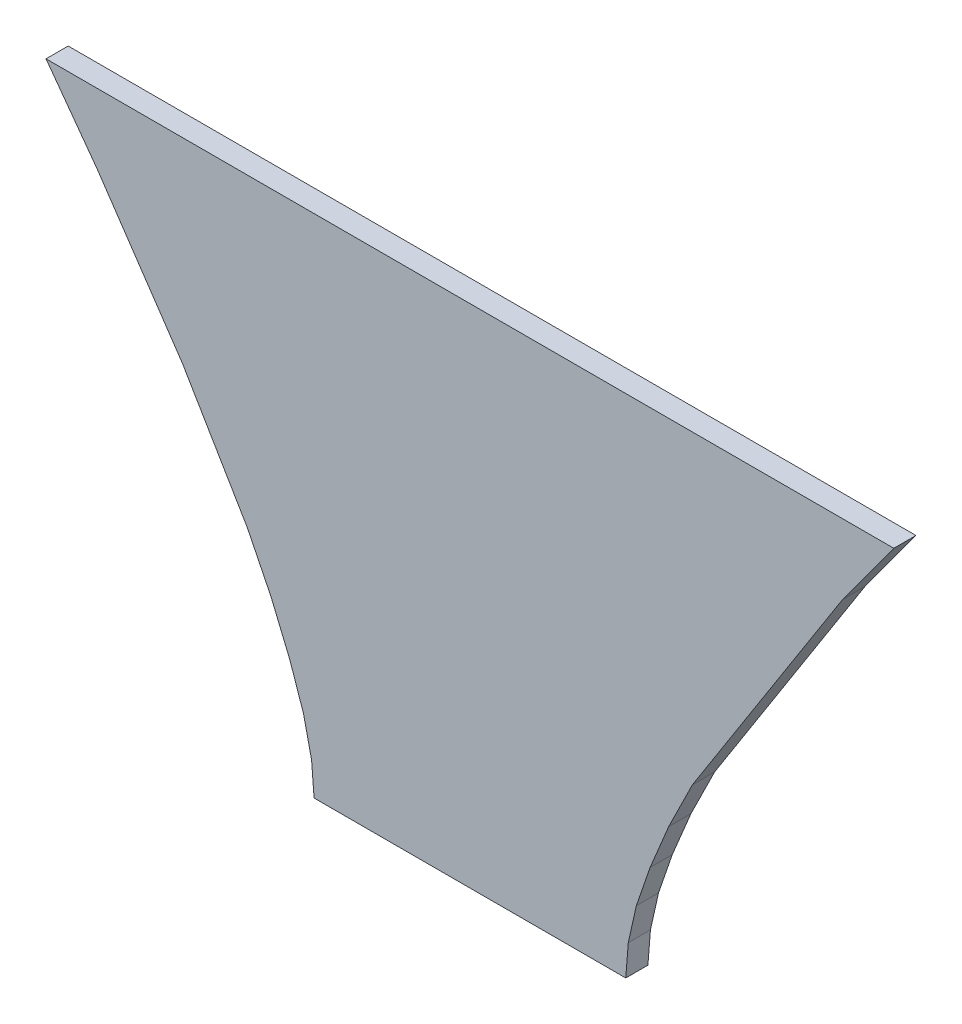
ISO-10303-21;
HEADER;
FILE_DESCRIPTION(('STEP AP214'),'2;1');
FILE_NAME('part.step','',(''),(''),'','','');
FILE_SCHEMA(('AUTOMOTIVE_DESIGN { 1 0 10303 214 1 1 1 1 }'));
ENDSEC;
DATA;
#1=APPLICATION_CONTEXT('core data for automotive mechanical design processes');
#2=APPLICATION_PROTOCOL_DEFINITION('international standard','automotive_design',2000,#1);
#3=PRODUCT_CONTEXT('',#1,'mechanical');
#4=PRODUCT('Part','Part','',(#3));
#5=PRODUCT_RELATED_PRODUCT_CATEGORY('part','',(#4));
#6=PRODUCT_DEFINITION_FORMATION('','',#4);
#7=PRODUCT_DEFINITION_CONTEXT('part definition',#1,'design');
#8=PRODUCT_DEFINITION('design','',#6,#7);
#9=PRODUCT_DEFINITION_SHAPE('','',#8);
#10=(LENGTH_UNIT() NAMED_UNIT(*) SI_UNIT(.MILLI.,.METRE.));
#11=(NAMED_UNIT(*) PLANE_ANGLE_UNIT() SI_UNIT($,.RADIAN.));
#12=(NAMED_UNIT(*) SI_UNIT($,.STERADIAN.) SOLID_ANGLE_UNIT());
#13=UNCERTAINTY_MEASURE_WITH_UNIT(LENGTH_MEASURE(1.E-05),#10,'distance_accuracy_value','');
#14=(GEOMETRIC_REPRESENTATION_CONTEXT(3) GLOBAL_UNCERTAINTY_ASSIGNED_CONTEXT((#13)) GLOBAL_UNIT_ASSIGNED_CONTEXT((#10,
#11,#12)) REPRESENTATION_CONTEXT('',''));
#15=CARTESIAN_POINT('',(0.,0.,0.));
#16=DIRECTION('',(0.,0.,1.));
#17=DIRECTION('',(1.,0.,0.));
#18=AXIS2_PLACEMENT_3D('',#15,#16,#17);
#19=CARTESIAN_POINT('',(78.3399963378906,100.407997131348,0.));
#20=DIRECTION('',(-0.996930394738995,0.0782929629376174,0.));
#21=DIRECTION('',(0.0782929629376174,0.996930394738995,0.));
#22=AXIS2_PLACEMENT_3D('',#19,#20,#21);
#23=PLANE('',#22);
#24=DIRECTION('',(0.0782929629376174,0.996930394738995,0.));
#25=VECTOR('',#24,1.);
#26=CARTESIAN_POINT('',(78.3399963378906,100.407997131348,0.03556));
#27=LINE('',#26,#25);
#28=CARTESIAN_POINT('',(78.3399963378906,100.407997131348,0.03556));
#29=VERTEX_POINT('',#28);
#30=CARTESIAN_POINT('',(78.3440017700195,100.458999633789,0.03556));
#31=VERTEX_POINT('',#30);
#32=EDGE_CURVE('E11',#29,#31,#27,.T.);
#33=ORIENTED_EDGE('',*,*,#32,.F.);
#34=DIRECTION('',(0.,0.,1.));
#35=VECTOR('',#34,1.);
#36=CARTESIAN_POINT('',(78.3399963378906,100.407997131348,0.));
#37=LINE('',#36,#35);
#38=CARTESIAN_POINT('',(78.3399963378906,100.407997131348,0.));
#39=VERTEX_POINT('',#38);
#40=EDGE_CURVE('E24',#39,#29,#37,.T.);
#41=ORIENTED_EDGE('',*,*,#40,.F.);
#42=DIRECTION('',(0.0782929629376174,0.996930394738995,0.));
#43=VECTOR('',#42,1.);
#44=CARTESIAN_POINT('',(78.3399963378906,100.407997131348,0.));
#45=LINE('',#44,#43);
#46=CARTESIAN_POINT('',(78.3440017700195,100.458999633789,0.));
#47=VERTEX_POINT('',#46);
#48=EDGE_CURVE('E154',#39,#47,#45,.T.);
#49=ORIENTED_EDGE('',*,*,#48,.T.);
#50=DIRECTION('',(0.,0.,1.));
#51=VECTOR('',#50,1.);
#52=CARTESIAN_POINT('',(78.3440017700195,100.458999633789,0.));
#53=LINE('',#52,#51);
#54=EDGE_CURVE('E37',#47,#31,#53,.T.);
#55=ORIENTED_EDGE('',*,*,#54,.T.);
#56=EDGE_LOOP('',(#33,#41,#49,#55));
#57=FACE_BOUND('',#56,.T.);
#58=ADVANCED_FACE('F17',(#57),#23,.F.);
#59=CARTESIAN_POINT('',(78.3440017700195,100.458999633789,0.));
#60=DIRECTION('',(-0.97578674307656,0.218724100263412,0.));
#61=DIRECTION('',(0.218724100263412,0.97578674307656,0.));
#62=AXIS2_PLACEMENT_3D('',#59,#60,#61);
#63=PLANE('',#62);
#64=DIRECTION('',(0.218724100263412,0.97578674307656,0.));
#65=VECTOR('',#64,1.);
#66=CARTESIAN_POINT('',(78.3440017700195,100.458999633789,0.03556));
#67=LINE('',#66,#65);
#68=CARTESIAN_POINT('',(78.3570022583008,100.516998291016,0.03556));
#69=VERTEX_POINT('',#68);
#70=EDGE_CURVE('E266',#31,#69,#67,.T.);
#71=ORIENTED_EDGE('',*,*,#70,.F.);
#72=ORIENTED_EDGE('',*,*,#54,.F.);
#73=DIRECTION('',(0.218724100263412,0.97578674307656,0.));
#74=VECTOR('',#73,1.);
#75=CARTESIAN_POINT('',(78.3440017700195,100.458999633789,0.));
#76=LINE('',#75,#74);
#77=CARTESIAN_POINT('',(78.3570022583008,100.516998291016,0.));
#78=VERTEX_POINT('',#77);
#79=EDGE_CURVE('E263',#47,#78,#76,.T.);
#80=ORIENTED_EDGE('',*,*,#79,.T.);
#81=DIRECTION('',(0.,0.,1.));
#82=VECTOR('',#81,1.);
#83=CARTESIAN_POINT('',(78.3570022583008,100.516998291016,0.));
#84=LINE('',#83,#82);
#85=EDGE_CURVE('E261',#78,#69,#84,.T.);
#86=ORIENTED_EDGE('',*,*,#85,.T.);
#87=EDGE_LOOP('',(#71,#72,#80,#86));
#88=FACE_BOUND('',#87,.T.);
#89=ADVANCED_FACE('F274',(#88),#63,.F.);
#90=CARTESIAN_POINT('',(78.3570022583008,100.516998291016,0.));
#91=DIRECTION('',(-0.945711505942707,0.325007303806511,0.));
#92=DIRECTION('',(0.325007303806511,0.945711505942707,0.));
#93=AXIS2_PLACEMENT_3D('',#90,#91,#92);
#94=PLANE('',#93);
#95=DIRECTION('',(0.325007303806511,0.945711505942707,0.));
#96=VECTOR('',#95,1.);
#97=CARTESIAN_POINT('',(78.3570022583008,100.516998291016,0.03556));
#98=LINE('',#97,#96);
#99=CARTESIAN_POINT('',(78.3789978027344,100.581001281738,0.03556));
#100=VERTEX_POINT('',#99);
#101=EDGE_CURVE('E258',#69,#100,#98,.T.);
#102=ORIENTED_EDGE('',*,*,#101,.F.);
#103=ORIENTED_EDGE('',*,*,#85,.F.);
#104=DIRECTION('',(0.325007303806511,0.945711505942707,0.));
#105=VECTOR('',#104,1.);
#106=CARTESIAN_POINT('',(78.3570022583008,100.516998291016,0.));
#107=LINE('',#106,#105);
#108=CARTESIAN_POINT('',(78.3789978027344,100.581001281738,0.));
#109=VERTEX_POINT('',#108);
#110=EDGE_CURVE('E255',#78,#109,#107,.T.);
#111=ORIENTED_EDGE('',*,*,#110,.T.);
#112=DIRECTION('',(0.,0.,1.));
#113=VECTOR('',#112,1.);
#114=CARTESIAN_POINT('',(78.3789978027344,100.581001281738,0.));
#115=LINE('',#114,#113);
#116=EDGE_CURVE('E253',#109,#100,#115,.T.);
#117=ORIENTED_EDGE('',*,*,#116,.T.);
#118=EDGE_LOOP('',(#102,#103,#111,#117));
#119=FACE_BOUND('',#118,.T.);
#120=ADVANCED_FACE('F280',(#119),#94,.F.);
#121=CARTESIAN_POINT('',(78.3789978027344,100.581001281738,0.));
#122=DIRECTION('',(-0.923079816984645,0.384608439163254,0.));
#123=DIRECTION('',(0.384608439163254,0.923079816984645,0.));
#124=AXIS2_PLACEMENT_3D('',#121,#122,#123);
#125=PLANE('',#124);
#126=DIRECTION('',(0.384608439163254,0.923079816984645,0.));
#127=VECTOR('',#126,1.);
#128=CARTESIAN_POINT('',(78.3789978027344,100.581001281738,0.03556));
#129=LINE('',#128,#127);
#130=CARTESIAN_POINT('',(78.4089965820312,100.65299987793,0.03556));
#131=VERTEX_POINT('',#130);
#132=EDGE_CURVE('E250',#100,#131,#129,.T.);
#133=ORIENTED_EDGE('',*,*,#132,.F.);
#134=ORIENTED_EDGE('',*,*,#116,.F.);
#135=DIRECTION('',(0.384608439163254,0.923079816984645,0.));
#136=VECTOR('',#135,1.);
#137=CARTESIAN_POINT('',(78.3789978027344,100.581001281738,0.));
#138=LINE('',#137,#136);
#139=CARTESIAN_POINT('',(78.4089965820312,100.65299987793,0.));
#140=VERTEX_POINT('',#139);
#141=EDGE_CURVE('E247',#109,#140,#138,.T.);
#142=ORIENTED_EDGE('',*,*,#141,.T.);
#143=DIRECTION('',(0.,0.,1.));
#144=VECTOR('',#143,1.);
#145=CARTESIAN_POINT('',(78.4089965820312,100.65299987793,0.));
#146=LINE('',#145,#144);
#147=EDGE_CURVE('E245',#140,#131,#146,.T.);
#148=ORIENTED_EDGE('',*,*,#147,.T.);
#149=EDGE_LOOP('',(#133,#134,#142,#148));
#150=FACE_BOUND('',#149,.T.);
#151=ADVANCED_FACE('F282',(#150),#125,.F.);
#152=CARTESIAN_POINT('',(78.4089965820312,100.65299987793,0.));
#153=DIRECTION('',(-0.896742891930274,0.44255190178388,0.));
#154=DIRECTION('',(0.44255190178388,0.896742891930274,0.));
#155=AXIS2_PLACEMENT_3D('',#152,#153,#154);
#156=PLANE('',#155);
#157=DIRECTION('',(0.44255190178388,0.896742891930274,0.));
#158=VECTOR('',#157,1.);
#159=CARTESIAN_POINT('',(78.4089965820312,100.65299987793,0.03556));
#160=LINE('',#159,#158);
#161=CARTESIAN_POINT('',(78.4469985961914,100.730003356934,0.03556));
#162=VERTEX_POINT('',#161);
#163=EDGE_CURVE('E242',#131,#162,#160,.T.);
#164=ORIENTED_EDGE('',*,*,#163,.F.);
#165=ORIENTED_EDGE('',*,*,#147,.F.);
#166=DIRECTION('',(0.44255190178388,0.896742891930274,0.));
#167=VECTOR('',#166,1.);
#168=CARTESIAN_POINT('',(78.4089965820312,100.65299987793,0.));
#169=LINE('',#168,#167);
#170=CARTESIAN_POINT('',(78.4469985961914,100.730003356934,0.));
#171=VERTEX_POINT('',#170);
#172=EDGE_CURVE('E239',#140,#171,#169,.T.);
#173=ORIENTED_EDGE('',*,*,#172,.T.);
#174=DIRECTION('',(0.,0.,1.));
#175=VECTOR('',#174,1.);
#176=CARTESIAN_POINT('',(78.4469985961914,100.730003356934,0.));
#177=LINE('',#176,#175);
#178=EDGE_CURVE('E237',#171,#162,#177,.T.);
#179=ORIENTED_EDGE('',*,*,#178,.T.);
#180=EDGE_LOOP('',(#164,#165,#173,#179));
#181=FACE_BOUND('',#180,.T.);
#182=ADVANCED_FACE('F287',(#181),#156,.F.);
#183=CARTESIAN_POINT('',(78.4469985961914,100.730003356934,0.));
#184=DIRECTION('',(-0.843195857171702,0.537606497773678,0.));
#185=DIRECTION('',(0.537606497773678,0.843195857171701,0.));
#186=AXIS2_PLACEMENT_3D('',#183,#184,#185);
#187=PLANE('',#186);
#188=DIRECTION('',(0.537606497773678,0.843195857171702,0.));
#189=VECTOR('',#188,1.);
#190=CARTESIAN_POINT('',(78.4469985961914,100.730003356934,0.03556));
#191=LINE('',#190,#189);
#192=CARTESIAN_POINT('',(78.6880035400391,101.108001708984,0.03556));
#193=VERTEX_POINT('',#192);
#194=EDGE_CURVE('E234',#162,#193,#191,.T.);
#195=ORIENTED_EDGE('',*,*,#194,.F.);
#196=ORIENTED_EDGE('',*,*,#178,.F.);
#197=DIRECTION('',(0.537606497773678,0.843195857171702,0.));
#198=VECTOR('',#197,1.);
#199=CARTESIAN_POINT('',(78.4469985961914,100.730003356934,0.));
#200=LINE('',#199,#198);
#201=CARTESIAN_POINT('',(78.6880035400391,101.108001708984,0.));
#202=VERTEX_POINT('',#201);
#203=EDGE_CURVE('E231',#171,#202,#200,.T.);
#204=ORIENTED_EDGE('',*,*,#203,.T.);
#205=DIRECTION('',(0.,0.,1.));
#206=VECTOR('',#205,1.);
#207=CARTESIAN_POINT('',(78.6880035400391,101.108001708984,0.));
#208=LINE('',#207,#206);
#209=EDGE_CURVE('E229',#202,#193,#208,.T.);
#210=ORIENTED_EDGE('',*,*,#209,.T.);
#211=EDGE_LOOP('',(#195,#196,#204,#210));
#212=FACE_BOUND('',#211,.T.);
#213=ADVANCED_FACE('F290',(#212),#187,.F.);
#214=CARTESIAN_POINT('',(78.6880035400391,101.108001708984,0.));
#215=DIRECTION('',(-0.806885275662672,0.590708178306999,0.));
#216=DIRECTION('',(0.590708178306999,0.806885275662672,0.));
#217=AXIS2_PLACEMENT_3D('',#214,#215,#216);
#218=PLANE('',#217);
#219=DIRECTION('',(0.590708178306999,0.806885275662672,0.));
#220=VECTOR('',#219,1.);
#221=CARTESIAN_POINT('',(78.6880035400391,101.108001708984,0.03556));
#222=LINE('',#221,#220);
#223=CARTESIAN_POINT('',(78.7699966430664,101.220001220703,0.03556));
#224=VERTEX_POINT('',#223);
#225=EDGE_CURVE('E226',#193,#224,#222,.T.);
#226=ORIENTED_EDGE('',*,*,#225,.F.);
#227=ORIENTED_EDGE('',*,*,#209,.F.);
#228=DIRECTION('',(0.590708178306999,0.806885275662672,0.));
#229=VECTOR('',#228,1.);
#230=CARTESIAN_POINT('',(78.6880035400391,101.108001708984,0.));
#231=LINE('',#230,#229);
#232=CARTESIAN_POINT('',(78.7699966430664,101.220001220703,0.));
#233=VERTEX_POINT('',#232);
#234=EDGE_CURVE('E223',#202,#233,#231,.T.);
#235=ORIENTED_EDGE('',*,*,#234,.T.);
#236=DIRECTION('',(0.,0.,1.));
#237=VECTOR('',#236,1.);
#238=CARTESIAN_POINT('',(78.7699966430664,101.220001220703,0.));
#239=LINE('',#238,#237);
#240=EDGE_CURVE('E221',#233,#224,#239,.T.);
#241=ORIENTED_EDGE('',*,*,#240,.T.);
#242=EDGE_LOOP('',(#226,#227,#235,#241));
#243=FACE_BOUND('',#242,.T.);
#244=ADVANCED_FACE('F295',(#243),#218,.F.);
#245=CARTESIAN_POINT('',(78.7699966430664,101.220001220703,0.));
#246=DIRECTION('',(0.,-1.,0.));
#247=DIRECTION('',(-1.,0.,0.));
#248=AXIS2_PLACEMENT_3D('',#245,#246,#247);
#249=PLANE('',#248);
#250=DIRECTION('',(-1.,0.,0.));
#251=VECTOR('',#250,1.);
#252=CARTESIAN_POINT('',(78.7699966430664,101.220001220703,0.03556));
#253=LINE('',#252,#251);
#254=CARTESIAN_POINT('',(77.4100036621094,101.220001220703,0.03556));
#255=VERTEX_POINT('',#254);
#256=EDGE_CURVE('E218',#224,#255,#253,.T.);
#257=ORIENTED_EDGE('',*,*,#256,.F.);
#258=ORIENTED_EDGE('',*,*,#240,.F.);
#259=DIRECTION('',(-1.,0.,0.));
#260=VECTOR('',#259,1.);
#261=CARTESIAN_POINT('',(78.7699966430664,101.220001220703,0.));
#262=LINE('',#261,#260);
#263=CARTESIAN_POINT('',(77.4100036621094,101.220001220703,0.));
#264=VERTEX_POINT('',#263);
#265=EDGE_CURVE('E215',#233,#264,#262,.T.);
#266=ORIENTED_EDGE('',*,*,#265,.T.);
#267=DIRECTION('',(0.,0.,1.));
#268=VECTOR('',#267,1.);
#269=CARTESIAN_POINT('',(77.4100036621094,101.220001220703,0.));
#270=LINE('',#269,#268);
#271=EDGE_CURVE('E213',#264,#255,#270,.T.);
#272=ORIENTED_EDGE('',*,*,#271,.T.);
#273=EDGE_LOOP('',(#257,#258,#266,#272));
#274=FACE_BOUND('',#273,.T.);
#275=ADVANCED_FACE('F298',(#274),#249,.F.);
#276=CARTESIAN_POINT('',(77.4100036621094,101.220001220703,0.));
#277=DIRECTION('',(0.806885275662672,0.590708178306999,0.));
#278=DIRECTION('',(0.590708178306999,-0.806885275662672,0.));
#279=AXIS2_PLACEMENT_3D('',#276,#277,#278);
#280=PLANE('',#279);
#281=DIRECTION('',(0.590708178306999,-0.806885275662672,0.));
#282=VECTOR('',#281,1.);
#283=CARTESIAN_POINT('',(77.4100036621094,101.220001220703,0.03556));
#284=LINE('',#283,#282);
#285=CARTESIAN_POINT('',(77.4919967651367,101.108001708984,0.03556));
#286=VERTEX_POINT('',#285);
#287=EDGE_CURVE('E210',#255,#286,#284,.T.);
#288=ORIENTED_EDGE('',*,*,#287,.F.);
#289=ORIENTED_EDGE('',*,*,#271,.F.);
#290=DIRECTION('',(0.590708178306999,-0.806885275662672,0.));
#291=VECTOR('',#290,1.);
#292=CARTESIAN_POINT('',(77.4100036621094,101.220001220703,0.));
#293=LINE('',#292,#291);
#294=CARTESIAN_POINT('',(77.4919967651367,101.108001708984,0.));
#295=VERTEX_POINT('',#294);
#296=EDGE_CURVE('E207',#264,#295,#293,.T.);
#297=ORIENTED_EDGE('',*,*,#296,.T.);
#298=DIRECTION('',(0.,0.,1.));
#299=VECTOR('',#298,1.);
#300=CARTESIAN_POINT('',(77.4919967651367,101.108001708984,0.));
#301=LINE('',#300,#299);
#302=EDGE_CURVE('E205',#295,#286,#301,.T.);
#303=ORIENTED_EDGE('',*,*,#302,.T.);
#304=EDGE_LOOP('',(#288,#289,#297,#303));
#305=FACE_BOUND('',#304,.T.);
#306=ADVANCED_FACE('F303',(#305),#280,.F.);
#307=CARTESIAN_POINT('',(77.4919967651367,101.108001708984,0.));
#308=DIRECTION('',(0.827614239267428,0.561297310666813,0.));
#309=DIRECTION('',(0.561297310666813,-0.827614239267428,0.));
#310=AXIS2_PLACEMENT_3D('',#307,#308,#309);
#311=PLANE('',#310);
#312=DIRECTION('',(0.561297310666813,-0.827614239267428,0.));
#313=VECTOR('',#312,1.);
#314=CARTESIAN_POINT('',(77.4919967651367,101.108001708984,0.03556));
#315=LINE('',#314,#313);
#316=CARTESIAN_POINT('',(77.6289978027344,100.90599822998,0.03556));
#317=VERTEX_POINT('',#316);
#318=EDGE_CURVE('E202',#286,#317,#315,.T.);
#319=ORIENTED_EDGE('',*,*,#318,.F.);
#320=ORIENTED_EDGE('',*,*,#302,.F.);
#321=DIRECTION('',(0.561297310666813,-0.827614239267428,0.));
#322=VECTOR('',#321,1.);
#323=CARTESIAN_POINT('',(77.4919967651367,101.108001708984,0.));
#324=LINE('',#323,#322);
#325=CARTESIAN_POINT('',(77.6289978027344,100.90599822998,0.));
#326=VERTEX_POINT('',#325);
#327=EDGE_CURVE('E199',#295,#326,#324,.T.);
#328=ORIENTED_EDGE('',*,*,#327,.T.);
#329=DIRECTION('',(0.,0.,1.));
#330=VECTOR('',#329,1.);
#331=CARTESIAN_POINT('',(77.6289978027344,100.90599822998,0.));
#332=LINE('',#331,#330);
#333=EDGE_CURVE('E197',#326,#317,#332,.T.);
#334=ORIENTED_EDGE('',*,*,#333,.T.);
#335=EDGE_LOOP('',(#319,#320,#328,#334));
#336=FACE_BOUND('',#335,.T.);
#337=ADVANCED_FACE('F306',(#336),#311,.F.);
#338=CARTESIAN_POINT('',(77.6289978027344,100.90599822998,0.));
#339=DIRECTION('',(0.860911668188919,0.508754459023381,0.));
#340=DIRECTION('',(0.508754459023381,-0.860911668188919,0.));
#341=AXIS2_PLACEMENT_3D('',#338,#339,#340);
#342=PLANE('',#341);
#343=DIRECTION('',(0.508754459023381,-0.860911668188919,0.));
#344=VECTOR('',#343,1.);
#345=CARTESIAN_POINT('',(77.6289978027344,100.90599822998,0.03556));
#346=LINE('',#345,#344);
#347=CARTESIAN_POINT('',(77.7330017089844,100.730003356934,0.03556));
#348=VERTEX_POINT('',#347);
#349=EDGE_CURVE('E194',#317,#348,#346,.T.);
#350=ORIENTED_EDGE('',*,*,#349,.F.);
#351=ORIENTED_EDGE('',*,*,#333,.F.);
#352=DIRECTION('',(0.508754459023381,-0.860911668188919,0.));
#353=VECTOR('',#352,1.);
#354=CARTESIAN_POINT('',(77.6289978027344,100.90599822998,0.));
#355=LINE('',#354,#353);
#356=CARTESIAN_POINT('',(77.7330017089844,100.730003356934,0.));
#357=VERTEX_POINT('',#356);
#358=EDGE_CURVE('E191',#326,#357,#355,.T.);
#359=ORIENTED_EDGE('',*,*,#358,.T.);
#360=DIRECTION('',(0.,0.,1.));
#361=VECTOR('',#360,1.);
#362=CARTESIAN_POINT('',(77.7330017089844,100.730003356934,0.));
#363=LINE('',#362,#361);
#364=EDGE_CURVE('E189',#357,#348,#363,.T.);
#365=ORIENTED_EDGE('',*,*,#364,.T.);
#366=EDGE_LOOP('',(#350,#351,#359,#365));
#367=FACE_BOUND('',#366,.T.);
#368=ADVANCED_FACE('F311',(#367),#342,.F.);
#369=CARTESIAN_POINT('',(77.7330017089844,100.730003356934,0.));
#370=DIRECTION('',(0.896742891930274,0.44255190178388,0.));
#371=DIRECTION('',(0.44255190178388,-0.896742891930274,0.));
#372=AXIS2_PLACEMENT_3D('',#369,#370,#371);
#373=PLANE('',#372);
#374=DIRECTION('',(0.44255190178388,-0.896742891930274,0.));
#375=VECTOR('',#374,1.);
#376=CARTESIAN_POINT('',(77.7330017089844,100.730003356934,0.03556));
#377=LINE('',#376,#375);
#378=CARTESIAN_POINT('',(77.7710037231445,100.65299987793,0.03556));
#379=VERTEX_POINT('',#378);
#380=EDGE_CURVE('E186',#348,#379,#377,.T.);
#381=ORIENTED_EDGE('',*,*,#380,.F.);
#382=ORIENTED_EDGE('',*,*,#364,.F.);
#383=DIRECTION('',(0.44255190178388,-0.896742891930274,0.));
#384=VECTOR('',#383,1.);
#385=CARTESIAN_POINT('',(77.7330017089844,100.730003356934,0.));
#386=LINE('',#385,#384);
#387=CARTESIAN_POINT('',(77.7710037231445,100.65299987793,0.));
#388=VERTEX_POINT('',#387);
#389=EDGE_CURVE('E183',#357,#388,#386,.T.);
#390=ORIENTED_EDGE('',*,*,#389,.T.);
#391=DIRECTION('',(0.,0.,1.));
#392=VECTOR('',#391,1.);
#393=CARTESIAN_POINT('',(77.7710037231445,100.65299987793,0.));
#394=LINE('',#393,#392);
#395=EDGE_CURVE('E181',#388,#379,#394,.T.);
#396=ORIENTED_EDGE('',*,*,#395,.T.);
#397=EDGE_LOOP('',(#381,#382,#390,#396));
#398=FACE_BOUND('',#397,.T.);
#399=ADVANCED_FACE('F314',(#398),#373,.F.);
#400=CARTESIAN_POINT('',(77.7710037231445,100.65299987793,0.));
#401=DIRECTION('',(0.923079816984645,0.384608439163254,0.));
#402=DIRECTION('',(0.384608439163254,-0.923079816984645,0.));
#403=AXIS2_PLACEMENT_3D('',#400,#401,#402);
#404=PLANE('',#403);
#405=DIRECTION('',(0.384608439163254,-0.923079816984645,0.));
#406=VECTOR('',#405,1.);
#407=CARTESIAN_POINT('',(77.7710037231445,100.65299987793,0.03556));
#408=LINE('',#407,#406);
#409=CARTESIAN_POINT('',(77.8010025024414,100.581001281738,0.03556));
#410=VERTEX_POINT('',#409);
#411=EDGE_CURVE('E178',#379,#410,#408,.T.);
#412=ORIENTED_EDGE('',*,*,#411,.F.);
#413=ORIENTED_EDGE('',*,*,#395,.F.);
#414=DIRECTION('',(0.384608439163254,-0.923079816984645,0.));
#415=VECTOR('',#414,1.);
#416=CARTESIAN_POINT('',(77.7710037231445,100.65299987793,0.));
#417=LINE('',#416,#415);
#418=CARTESIAN_POINT('',(77.8010025024414,100.581001281738,0.));
#419=VERTEX_POINT('',#418);
#420=EDGE_CURVE('E175',#388,#419,#417,.T.);
#421=ORIENTED_EDGE('',*,*,#420,.T.);
#422=DIRECTION('',(0.,0.,1.));
#423=VECTOR('',#422,1.);
#424=CARTESIAN_POINT('',(77.8010025024414,100.581001281738,0.));
#425=LINE('',#424,#423);
#426=EDGE_CURVE('E173',#419,#410,#425,.T.);
#427=ORIENTED_EDGE('',*,*,#426,.T.);
#428=EDGE_LOOP('',(#412,#413,#421,#427));
#429=FACE_BOUND('',#428,.T.);
#430=ADVANCED_FACE('F319',(#429),#404,.F.);
#431=CARTESIAN_POINT('',(77.8010025024414,100.581001281738,0.));
#432=DIRECTION('',(0.945711505942707,0.325007303806511,0.));
#433=DIRECTION('',(0.325007303806511,-0.945711505942707,0.));
#434=AXIS2_PLACEMENT_3D('',#431,#432,#433);
#435=PLANE('',#434);
#436=DIRECTION('',(0.325007303806511,-0.945711505942707,0.));
#437=VECTOR('',#436,1.);
#438=CARTESIAN_POINT('',(77.8010025024414,100.581001281738,0.03556));
#439=LINE('',#438,#437);
#440=CARTESIAN_POINT('',(77.822998046875,100.516998291016,0.03556));
#441=VERTEX_POINT('',#440);
#442=EDGE_CURVE('E170',#410,#441,#439,.T.);
#443=ORIENTED_EDGE('',*,*,#442,.F.);
#444=ORIENTED_EDGE('',*,*,#426,.F.);
#445=DIRECTION('',(0.325007303806511,-0.945711505942707,0.));
#446=VECTOR('',#445,1.);
#447=CARTESIAN_POINT('',(77.8010025024414,100.581001281738,0.));
#448=LINE('',#447,#446);
#449=CARTESIAN_POINT('',(77.822998046875,100.516998291016,0.));
#450=VERTEX_POINT('',#449);
#451=EDGE_CURVE('E167',#419,#450,#448,.T.);
#452=ORIENTED_EDGE('',*,*,#451,.T.);
#453=DIRECTION('',(0.,0.,1.));
#454=VECTOR('',#453,1.);
#455=CARTESIAN_POINT('',(77.822998046875,100.516998291016,0.));
#456=LINE('',#455,#454);
#457=EDGE_CURVE('E165',#450,#441,#456,.T.);
#458=ORIENTED_EDGE('',*,*,#457,.T.);
#459=EDGE_LOOP('',(#443,#444,#452,#458));
#460=FACE_BOUND('',#459,.T.);
#461=ADVANCED_FACE('F322',(#460),#435,.F.);
#462=CARTESIAN_POINT('',(77.822998046875,100.516998291016,0.));
#463=DIRECTION('',(0.97578674307656,0.218724100263412,0.));
#464=DIRECTION('',(0.218724100263412,-0.97578674307656,0.));
#465=AXIS2_PLACEMENT_3D('',#462,#463,#464);
#466=PLANE('',#465);
#467=DIRECTION('',(0.218724100263412,-0.97578674307656,0.));
#468=VECTOR('',#467,1.);
#469=CARTESIAN_POINT('',(77.822998046875,100.516998291016,0.03556));
#470=LINE('',#469,#468);
#471=CARTESIAN_POINT('',(77.8359985351563,100.458999633789,0.03556));
#472=VERTEX_POINT('',#471);
#473=EDGE_CURVE('E162',#441,#472,#470,.T.);
#474=ORIENTED_EDGE('',*,*,#473,.F.);
#475=ORIENTED_EDGE('',*,*,#457,.F.);
#476=DIRECTION('',(0.218724100263412,-0.97578674307656,0.));
#477=VECTOR('',#476,1.);
#478=CARTESIAN_POINT('',(77.822998046875,100.516998291016,0.));
#479=LINE('',#478,#477);
#480=CARTESIAN_POINT('',(77.8359985351563,100.458999633789,0.));
#481=VERTEX_POINT('',#480);
#482=EDGE_CURVE('E160',#450,#481,#479,.T.);
#483=ORIENTED_EDGE('',*,*,#482,.T.);
#484=DIRECTION('',(0.,0.,1.));
#485=VECTOR('',#484,1.);
#486=CARTESIAN_POINT('',(77.8359985351563,100.458999633789,0.));
#487=LINE('',#486,#485);
#488=EDGE_CURVE('E145',#481,#472,#487,.T.);
#489=ORIENTED_EDGE('',*,*,#488,.T.);
#490=EDGE_LOOP('',(#474,#475,#483,#489));
#491=FACE_BOUND('',#490,.T.);
#492=ADVANCED_FACE('F325',(#491),#466,.F.);
#493=CARTESIAN_POINT('',(77.8359985351563,100.458999633789,0.));
#494=DIRECTION('',(0.996942023803503,0.0781447450221444,0.));
#495=DIRECTION('',(0.0781447450221444,-0.996942023803503,0.));
#496=AXIS2_PLACEMENT_3D('',#493,#494,#495);
#497=PLANE('',#496);
#498=DIRECTION('',(0.0781447450221444,-0.996942023803503,0.));
#499=VECTOR('',#498,1.);
#500=CARTESIAN_POINT('',(77.8359985351563,100.458999633789,0.03556));
#501=LINE('',#500,#499);
#502=CARTESIAN_POINT('',(77.8399963378906,100.407997131348,0.03556));
#503=VERTEX_POINT('',#502);
#504=EDGE_CURVE('E149',#472,#503,#501,.T.);
#505=ORIENTED_EDGE('',*,*,#504,.F.);
#506=ORIENTED_EDGE('',*,*,#488,.F.);
#507=DIRECTION('',(0.0781447450221444,-0.996942023803503,0.));
#508=VECTOR('',#507,1.);
#509=CARTESIAN_POINT('',(77.8359985351563,100.458999633789,0.));
#510=LINE('',#509,#508);
#511=CARTESIAN_POINT('',(77.8399963378906,100.407997131348,0.));
#512=VERTEX_POINT('',#511);
#513=EDGE_CURVE('E141',#481,#512,#510,.T.);
#514=ORIENTED_EDGE('',*,*,#513,.T.);
#515=DIRECTION('',(0.,0.,1.));
#516=VECTOR('',#515,1.);
#517=CARTESIAN_POINT('',(77.8399963378906,100.407997131348,0.));
#518=LINE('',#517,#516);
#519=EDGE_CURVE('E131',#512,#503,#518,.T.);
#520=ORIENTED_EDGE('',*,*,#519,.T.);
#521=EDGE_LOOP('',(#505,#506,#514,#520));
#522=FACE_BOUND('',#521,.T.);
#523=ADVANCED_FACE('F144',(#522),#497,.F.);
#524=CARTESIAN_POINT('',(77.8399963378906,100.407997131348,0.));
#525=DIRECTION('',(0.,1.,0.));
#526=DIRECTION('',(1.,0.,0.));
#527=AXIS2_PLACEMENT_3D('',#524,#525,#526);
#528=PLANE('',#527);
#529=DIRECTION('',(1.,0.,0.));
#530=VECTOR('',#529,1.);
#531=CARTESIAN_POINT('',(77.8399963378906,100.407997131348,0.03556));
#532=LINE('',#531,#530);
#533=EDGE_CURVE('E137',#503,#29,#532,.T.);
#534=ORIENTED_EDGE('',*,*,#533,.F.);
#535=ORIENTED_EDGE('',*,*,#519,.F.);
#536=DIRECTION('',(1.,0.,0.));
#537=VECTOR('',#536,1.);
#538=CARTESIAN_POINT('',(77.8399963378906,100.407997131348,0.));
#539=LINE('',#538,#537);
#540=EDGE_CURVE('E135',#512,#39,#539,.T.);
#541=ORIENTED_EDGE('',*,*,#540,.T.);
#542=ORIENTED_EDGE('',*,*,#40,.T.);
#543=EDGE_LOOP('',(#534,#535,#541,#542));
#544=FACE_BOUND('',#543,.T.);
#545=ADVANCED_FACE('F133',(#544),#528,.F.);
#546=CARTESIAN_POINT('',(78.3399963378906,100.407997131348,0.));
#547=DIRECTION('',(0.,0.,1.));
#548=DIRECTION('',(1.,0.,0.));
#549=AXIS2_PLACEMENT_3D('',#546,#547,#548);
#550=PLANE('',#549);
#551=ORIENTED_EDGE('',*,*,#540,.F.);
#552=ORIENTED_EDGE('',*,*,#513,.F.);
#553=ORIENTED_EDGE('',*,*,#482,.F.);
#554=ORIENTED_EDGE('',*,*,#451,.F.);
#555=ORIENTED_EDGE('',*,*,#420,.F.);
#556=ORIENTED_EDGE('',*,*,#389,.F.);
#557=ORIENTED_EDGE('',*,*,#358,.F.);
#558=ORIENTED_EDGE('',*,*,#327,.F.);
#559=ORIENTED_EDGE('',*,*,#296,.F.);
#560=ORIENTED_EDGE('',*,*,#265,.F.);
#561=ORIENTED_EDGE('',*,*,#234,.F.);
#562=ORIENTED_EDGE('',*,*,#203,.F.);
#563=ORIENTED_EDGE('',*,*,#172,.F.);
#564=ORIENTED_EDGE('',*,*,#141,.F.);
#565=ORIENTED_EDGE('',*,*,#110,.F.);
#566=ORIENTED_EDGE('',*,*,#79,.F.);
#567=ORIENTED_EDGE('',*,*,#48,.F.);
#568=EDGE_LOOP('',(#551,#552,#553,#554,#555,#556,#557,#558,#559,#560,#561,#562,#563,#564,#565,
#566,#567));
#569=FACE_BOUND('',#568,.T.);
#570=ADVANCED_FACE('F152',(#569),#550,.F.);
#571=CARTESIAN_POINT('',(78.3399963378906,100.407997131348,0.03556));
#572=DIRECTION('',(0.,0.,1.));
#573=DIRECTION('',(1.,0.,0.));
#574=AXIS2_PLACEMENT_3D('',#571,#572,#573);
#575=PLANE('',#574);
#576=ORIENTED_EDGE('',*,*,#32,.T.);
#577=ORIENTED_EDGE('',*,*,#70,.T.);
#578=ORIENTED_EDGE('',*,*,#101,.T.);
#579=ORIENTED_EDGE('',*,*,#132,.T.);
#580=ORIENTED_EDGE('',*,*,#163,.T.);
#581=ORIENTED_EDGE('',*,*,#194,.T.);
#582=ORIENTED_EDGE('',*,*,#225,.T.);
#583=ORIENTED_EDGE('',*,*,#256,.T.);
#584=ORIENTED_EDGE('',*,*,#287,.T.);
#585=ORIENTED_EDGE('',*,*,#318,.T.);
#586=ORIENTED_EDGE('',*,*,#349,.T.);
#587=ORIENTED_EDGE('',*,*,#380,.T.);
#588=ORIENTED_EDGE('',*,*,#411,.T.);
#589=ORIENTED_EDGE('',*,*,#442,.T.);
#590=ORIENTED_EDGE('',*,*,#473,.T.);
#591=ORIENTED_EDGE('',*,*,#504,.T.);
#592=ORIENTED_EDGE('',*,*,#533,.T.);
#593=EDGE_LOOP('',(#576,#577,#578,#579,#580,#581,#582,#583,#584,#585,#586,#587,#588,#589,#590,
#591,#592));
#594=FACE_BOUND('',#593,.T.);
#595=ADVANCED_FACE('F277',(#594),#575,.T.);
#596=CLOSED_SHELL('',(#58,#89,#120,#151,#182,#213,#244,#275,#306,#337,#368,#399,#430,#461,#492,
#523,#545,#570,#595));
#597=MANIFOLD_SOLID_BREP('B1',#596);
#598=ADVANCED_BREP_SHAPE_REPRESENTATION('',(#18,#597),#14);
#599=SHAPE_DEFINITION_REPRESENTATION(#9,#598);
ENDSEC;
END-ISO-10303-21;
